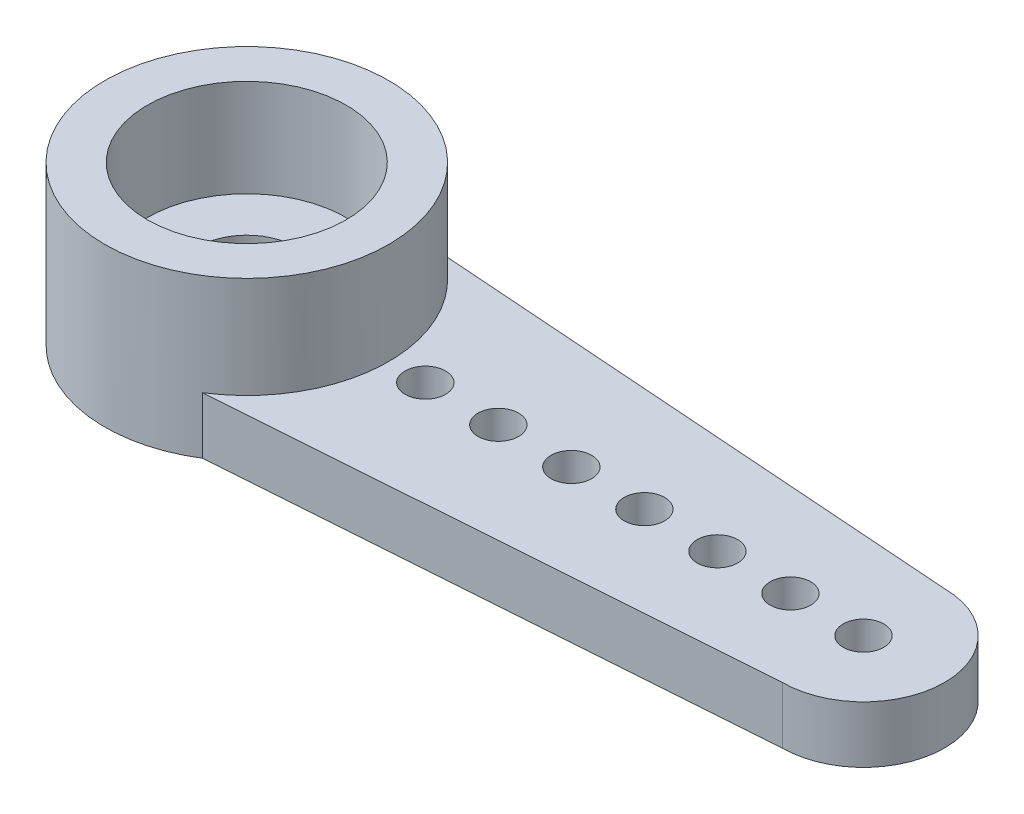
ISO-10303-21;
HEADER;
FILE_DESCRIPTION(('STEP AP214'),'2;1');
FILE_NAME('part.step','',(''),(''),'','','');
FILE_SCHEMA(('AUTOMOTIVE_DESIGN { 1 0 10303 214 1 1 1 1 }'));
ENDSEC;
DATA;
#1=APPLICATION_CONTEXT('core data for automotive mechanical design processes');
#2=APPLICATION_PROTOCOL_DEFINITION('international standard','automotive_design',2000,#1);
#3=PRODUCT_CONTEXT('',#1,'mechanical');
#4=PRODUCT('Part','Part','',(#3));
#5=PRODUCT_RELATED_PRODUCT_CATEGORY('part','',(#4));
#6=PRODUCT_DEFINITION_FORMATION('','',#4);
#7=PRODUCT_DEFINITION_CONTEXT('part definition',#1,'design');
#8=PRODUCT_DEFINITION('design','',#6,#7);
#9=PRODUCT_DEFINITION_SHAPE('','',#8);
#10=(LENGTH_UNIT() NAMED_UNIT(*) SI_UNIT(.MILLI.,.METRE.));
#11=(NAMED_UNIT(*) PLANE_ANGLE_UNIT() SI_UNIT($,.RADIAN.));
#12=(NAMED_UNIT(*) SI_UNIT($,.STERADIAN.) SOLID_ANGLE_UNIT());
#13=UNCERTAINTY_MEASURE_WITH_UNIT(LENGTH_MEASURE(1.E-05),#10,'distance_accuracy_value','');
#14=(GEOMETRIC_REPRESENTATION_CONTEXT(3) GLOBAL_UNCERTAINTY_ASSIGNED_CONTEXT((#13)) GLOBAL_UNIT_ASSIGNED_CONTEXT((#10,
#11,#12)) REPRESENTATION_CONTEXT('',''));
#15=CARTESIAN_POINT('',(0.,0.,0.));
#16=DIRECTION('',(0.,0.,1.));
#17=DIRECTION('',(1.,0.,0.));
#18=AXIS2_PLACEMENT_3D('',#15,#16,#17);
#19=CARTESIAN_POINT('',(-20.1688064969277,1.42837263825871,0.));
#20=DIRECTION('',(0.,1.,0.));
#21=DIRECTION('',(0.,0.,1.));
#22=AXIS2_PLACEMENT_3D('',#19,#20,#21);
#23=PLANE('',#22);
#24=CARTESIAN_POINT('',(6.58119350307226,1.42837263825871,0.));
#25=DIRECTION('',(0.,1.,0.));
#26=DIRECTION('',(0.,0.,1.));
#27=AXIS2_PLACEMENT_3D('',#24,#25,#26);
#28=CIRCLE('',#27,0.624999999999997);
#29=CARTESIAN_POINT('',(6.58119350307226,1.42837263825871,0.625000000000067));
#30=VERTEX_POINT('',#29);
#31=EDGE_CURVE('E133',#30,#30,#28,.T.);
#32=ORIENTED_EDGE('',*,*,#31,.F.);
#33=EDGE_LOOP('',(#32));
#34=FACE_BOUND('',#33,.T.);
#35=CARTESIAN_POINT('',(11.0811935030723,1.42837263825871,0.));
#36=DIRECTION('',(0.,1.,0.));
#37=DIRECTION('',(0.,0.,1.));
#38=AXIS2_PLACEMENT_3D('',#35,#36,#37);
#39=CIRCLE('',#38,0.624999999999997);
#40=CARTESIAN_POINT('',(11.0811935030723,1.42837263825871,0.625000000000036));
#41=VERTEX_POINT('',#40);
#42=EDGE_CURVE('E145',#41,#41,#39,.T.);
#43=ORIENTED_EDGE('',*,*,#42,.F.);
#44=EDGE_LOOP('',(#43));
#45=FACE_BOUND('',#44,.T.);
#46=CARTESIAN_POINT('',(15.5811935030723,1.42837263825871,0.));
#47=DIRECTION('',(0.,1.,0.));
#48=DIRECTION('',(0.,0.,1.));
#49=AXIS2_PLACEMENT_3D('',#46,#47,#48);
#50=CIRCLE('',#49,0.624999999999997);
#51=CARTESIAN_POINT('',(15.5811935030723,1.42837263825871,0.625000000000004));
#52=VERTEX_POINT('',#51);
#53=EDGE_CURVE('E157',#52,#52,#50,.T.);
#54=ORIENTED_EDGE('',*,*,#53,.F.);
#55=EDGE_LOOP('',(#54));
#56=FACE_BOUND('',#55,.T.);
#57=CARTESIAN_POINT('',(17.8311935030723,1.42837263825871,0.));
#58=DIRECTION('',(0.,1.,0.));
#59=DIRECTION('',(0.,0.,1.));
#60=AXIS2_PLACEMENT_3D('',#57,#58,#59);
#61=CIRCLE('',#60,0.624999999999997);
#62=CARTESIAN_POINT('',(17.8311935030723,1.42837263825871,0.624999999999988));
#63=VERTEX_POINT('',#62);
#64=EDGE_CURVE('E163',#63,#63,#61,.T.);
#65=ORIENTED_EDGE('',*,*,#64,.F.);
#66=EDGE_LOOP('',(#65));
#67=FACE_BOUND('',#66,.T.);
#68=CARTESIAN_POINT('',(13.3311935030723,1.42837263825871,0.));
#69=DIRECTION('',(0.,1.,0.));
#70=DIRECTION('',(0.,0.,1.));
#71=AXIS2_PLACEMENT_3D('',#68,#69,#70);
#72=CIRCLE('',#71,0.624999999999999);
#73=CARTESIAN_POINT('',(13.3311935030723,1.42837263825871,0.625000000000022));
#74=VERTEX_POINT('',#73);
#75=EDGE_CURVE('E151',#74,#74,#72,.T.);
#76=ORIENTED_EDGE('',*,*,#75,.F.);
#77=EDGE_LOOP('',(#76));
#78=FACE_BOUND('',#77,.T.);
#79=CARTESIAN_POINT('',(8.83119350307226,1.42837263825871,0.));
#80=DIRECTION('',(0.,1.,0.));
#81=DIRECTION('',(0.,0.,1.));
#82=AXIS2_PLACEMENT_3D('',#79,#80,#81);
#83=CIRCLE('',#82,0.624999999999997);
#84=CARTESIAN_POINT('',(8.83119350307226,1.42837263825871,0.625000000000051));
#85=VERTEX_POINT('',#84);
#86=EDGE_CURVE('E139',#85,#85,#83,.T.);
#87=ORIENTED_EDGE('',*,*,#86,.F.);
#88=EDGE_LOOP('',(#87));
#89=FACE_BOUND('',#88,.T.);
#90=CARTESIAN_POINT('',(4.33119350307226,1.42837263825871,0.));
#91=DIRECTION('',(0.,1.,0.));
#92=DIRECTION('',(0.,0.,1.));
#93=AXIS2_PLACEMENT_3D('',#90,#91,#92);
#94=CIRCLE('',#93,0.624999999999997);
#95=CARTESIAN_POINT('',(4.33119350307226,1.42837263825871,0.625000000000083));
#96=VERTEX_POINT('',#95);
#97=EDGE_CURVE('E127',#96,#96,#94,.T.);
#98=ORIENTED_EDGE('',*,*,#97,.F.);
#99=EDGE_LOOP('',(#98));
#100=FACE_BOUND('',#99,.T.);
#101=CARTESIAN_POINT('',(-1.16880649692774,1.42837263825871,0.));
#102=DIRECTION('',(0.,1.,0.));
#103=DIRECTION('',(0.,0.,1.));
#104=AXIS2_PLACEMENT_3D('',#101,#102,#103);
#105=CIRCLE('',#104,4.375);
#106=CARTESIAN_POINT('',(1.16692439419594,1.42837263825871,3.69932239798731));
#107=VERTEX_POINT('',#106);
#108=CARTESIAN_POINT('',(1.16692439419594,1.42837263825871,-3.69932239798731));
#109=VERTEX_POINT('',#108);
#110=EDGE_CURVE('E93',#107,#109,#105,.T.);
#111=ORIENTED_EDGE('',*,*,#110,.F.);
#112=DIRECTION('',(0.997420198870011,0.,-0.0717840294641297));
#113=VECTOR('',#112,1.);
#114=CARTESIAN_POINT('',(-19.7939974128962,1.42837263825871,5.20787358864924));
#115=LINE('',#114,#113);
#116=CARTESIAN_POINT('',(17.8311935030723,1.42837263825871,2.5));
#117=VERTEX_POINT('',#116);
#118=EDGE_CURVE('E107',#107,#117,#115,.T.);
#119=ORIENTED_EDGE('',*,*,#118,.T.);
#120=CARTESIAN_POINT('',(17.8311935030723,1.42837263825871,0.));
#121=DIRECTION('',(0.,1.,0.));
#122=DIRECTION('',(0.,0.,-1.));
#123=AXIS2_PLACEMENT_3D('',#120,#121,#122);
#124=CIRCLE('',#123,2.5);
#125=CARTESIAN_POINT('',(17.8311935030723,1.42837263825871,-2.5));
#126=VERTEX_POINT('',#125);
#127=EDGE_CURVE('E169',#117,#126,#124,.T.);
#128=ORIENTED_EDGE('',*,*,#127,.T.);
#129=DIRECTION('',(-0.997420198870011,0.,-0.0717840294641295));
#130=VECTOR('',#129,1.);
#131=CARTESIAN_POINT('',(-19.7939974128962,1.42837263825871,-5.20787358864924));
#132=LINE('',#131,#130);
#133=EDGE_CURVE('E104',#126,#109,#132,.T.);
#134=ORIENTED_EDGE('',*,*,#133,.T.);
#135=EDGE_LOOP('',(#111,#119,#128,#134));
#136=FACE_BOUND('',#135,.T.);
#137=ADVANCED_FACE('F40',(#34,#45,#56,#67,#78,#89,#100,#136),#23,.T.);
#138=CARTESIAN_POINT('',(-20.1688064969277,-0.321627361741287,0.));
#139=DIRECTION('',(0.,1.,0.));
#140=DIRECTION('',(0.,0.,1.));
#141=AXIS2_PLACEMENT_3D('',#138,#139,#140);
#142=PLANE('',#141);
#143=CARTESIAN_POINT('',(-1.16880649692774,-0.321627361741287,0.));
#144=DIRECTION('',(0.,-1.,0.));
#145=DIRECTION('',(0.,0.,-1.));
#146=AXIS2_PLACEMENT_3D('',#143,#144,#145);
#147=CIRCLE('',#146,2.9375);
#148=CARTESIAN_POINT('',(-1.16880649692774,-0.321627361741287,-2.9375));
#149=VERTEX_POINT('',#148);
#150=EDGE_CURVE('E119',#149,#149,#147,.T.);
#151=ORIENTED_EDGE('',*,*,#150,.F.);
#152=EDGE_LOOP('',(#151));
#153=FACE_BOUND('',#152,.T.);
#154=CARTESIAN_POINT('',(17.8311935030723,-0.321627361741287,0.));
#155=DIRECTION('',(0.,1.,0.));
#156=DIRECTION('',(0.,0.,1.));
#157=AXIS2_PLACEMENT_3D('',#154,#155,#156);
#158=CIRCLE('',#157,0.624999999999997);
#159=CARTESIAN_POINT('',(17.8311935030723,-0.321627361741287,0.624999999999988));
#160=VERTEX_POINT('',#159);
#161=EDGE_CURVE('E160',#160,#160,#158,.T.);
#162=ORIENTED_EDGE('',*,*,#161,.T.);
#163=EDGE_LOOP('',(#162));
#164=FACE_BOUND('',#163,.T.);
#165=CARTESIAN_POINT('',(15.5811935030723,-0.321627361741287,0.));
#166=DIRECTION('',(0.,1.,0.));
#167=DIRECTION('',(0.,0.,1.));
#168=AXIS2_PLACEMENT_3D('',#165,#166,#167);
#169=CIRCLE('',#168,0.624999999999997);
#170=CARTESIAN_POINT('',(15.5811935030723,-0.321627361741287,0.625000000000004));
#171=VERTEX_POINT('',#170);
#172=EDGE_CURVE('E154',#171,#171,#169,.T.);
#173=ORIENTED_EDGE('',*,*,#172,.T.);
#174=EDGE_LOOP('',(#173));
#175=FACE_BOUND('',#174,.T.);
#176=CARTESIAN_POINT('',(13.3311935030723,-0.321627361741287,0.));
#177=DIRECTION('',(0.,1.,0.));
#178=DIRECTION('',(0.,0.,1.));
#179=AXIS2_PLACEMENT_3D('',#176,#177,#178);
#180=CIRCLE('',#179,0.624999999999999);
#181=CARTESIAN_POINT('',(13.3311935030723,-0.321627361741287,0.625000000000022));
#182=VERTEX_POINT('',#181);
#183=EDGE_CURVE('E148',#182,#182,#180,.T.);
#184=ORIENTED_EDGE('',*,*,#183,.T.);
#185=EDGE_LOOP('',(#184));
#186=FACE_BOUND('',#185,.T.);
#187=CARTESIAN_POINT('',(11.0811935030723,-0.321627361741287,0.));
#188=DIRECTION('',(0.,1.,0.));
#189=DIRECTION('',(0.,0.,1.));
#190=AXIS2_PLACEMENT_3D('',#187,#188,#189);
#191=CIRCLE('',#190,0.624999999999997);
#192=CARTESIAN_POINT('',(11.0811935030723,-0.321627361741287,0.625000000000036));
#193=VERTEX_POINT('',#192);
#194=EDGE_CURVE('E142',#193,#193,#191,.T.);
#195=ORIENTED_EDGE('',*,*,#194,.T.);
#196=EDGE_LOOP('',(#195));
#197=FACE_BOUND('',#196,.T.);
#198=CARTESIAN_POINT('',(8.83119350307226,-0.321627361741287,0.));
#199=DIRECTION('',(0.,1.,0.));
#200=DIRECTION('',(0.,0.,1.));
#201=AXIS2_PLACEMENT_3D('',#198,#199,#200);
#202=CIRCLE('',#201,0.624999999999997);
#203=CARTESIAN_POINT('',(8.83119350307226,-0.321627361741287,0.625000000000051));
#204=VERTEX_POINT('',#203);
#205=EDGE_CURVE('E136',#204,#204,#202,.T.);
#206=ORIENTED_EDGE('',*,*,#205,.T.);
#207=EDGE_LOOP('',(#206));
#208=FACE_BOUND('',#207,.T.);
#209=CARTESIAN_POINT('',(6.58119350307226,-0.321627361741287,0.));
#210=DIRECTION('',(0.,1.,0.));
#211=DIRECTION('',(0.,0.,1.));
#212=AXIS2_PLACEMENT_3D('',#209,#210,#211);
#213=CIRCLE('',#212,0.624999999999997);
#214=CARTESIAN_POINT('',(6.58119350307226,-0.321627361741287,0.625000000000067));
#215=VERTEX_POINT('',#214);
#216=EDGE_CURVE('E130',#215,#215,#213,.T.);
#217=ORIENTED_EDGE('',*,*,#216,.T.);
#218=EDGE_LOOP('',(#217));
#219=FACE_BOUND('',#218,.T.);
#220=CARTESIAN_POINT('',(4.33119350307226,-0.321627361741287,0.));
#221=DIRECTION('',(0.,1.,0.));
#222=DIRECTION('',(0.,0.,1.));
#223=AXIS2_PLACEMENT_3D('',#220,#221,#222);
#224=CIRCLE('',#223,0.624999999999997);
#225=CARTESIAN_POINT('',(4.33119350307226,-0.321627361741287,0.625000000000083));
#226=VERTEX_POINT('',#225);
#227=EDGE_CURVE('E124',#226,#226,#224,.T.);
#228=ORIENTED_EDGE('',*,*,#227,.T.);
#229=EDGE_LOOP('',(#228));
#230=FACE_BOUND('',#229,.T.);
#231=CARTESIAN_POINT('',(-1.16880649692774,-0.321627361741287,0.));
#232=DIRECTION('',(0.,-1.,0.));
#233=DIRECTION('',(0.,0.,-1.));
#234=AXIS2_PLACEMENT_3D('',#231,#232,#233);
#235=CIRCLE('',#234,4.375);
#236=CARTESIAN_POINT('',(1.16692439419594,-0.321627361741287,3.69932239798731));
#237=VERTEX_POINT('',#236);
#238=CARTESIAN_POINT('',(1.16692439419594,-0.321627361741287,-3.69932239798731));
#239=VERTEX_POINT('',#238);
#240=EDGE_CURVE('E78',#237,#239,#235,.T.);
#241=ORIENTED_EDGE('',*,*,#240,.T.);
#242=DIRECTION('',(0.997420198870011,0.,0.0717840294641295));
#243=VECTOR('',#242,1.);
#244=CARTESIAN_POINT('',(1.16692439419594,-0.321627361741287,-3.69932239798731));
#245=LINE('',#244,#243);
#246=CARTESIAN_POINT('',(17.8311935030723,-0.321627361741287,-2.5));
#247=VERTEX_POINT('',#246);
#248=EDGE_CURVE('E83',#239,#247,#245,.T.);
#249=ORIENTED_EDGE('',*,*,#248,.T.);
#250=CARTESIAN_POINT('',(17.8311935030723,-0.321627361741287,0.));
#251=DIRECTION('',(0.,1.,0.));
#252=DIRECTION('',(0.,0.,-1.));
#253=AXIS2_PLACEMENT_3D('',#250,#251,#252);
#254=CIRCLE('',#253,2.5);
#255=CARTESIAN_POINT('',(17.8311935030722,-0.321627361741287,2.49999999999999));
#256=VERTEX_POINT('',#255);
#257=EDGE_CURVE('E166',#256,#247,#254,.T.);
#258=ORIENTED_EDGE('',*,*,#257,.F.);
#259=DIRECTION('',(-0.997420198870011,0.,0.0717840294641296));
#260=VECTOR('',#259,1.);
#261=CARTESIAN_POINT('',(17.8311935030723,-0.321627361741287,2.5));
#262=LINE('',#261,#260);
#263=EDGE_CURVE('E55',#256,#237,#262,.T.);
#264=ORIENTED_EDGE('',*,*,#263,.T.);
#265=EDGE_LOOP('',(#241,#249,#258,#264));
#266=FACE_BOUND('',#265,.T.);
#267=ADVANCED_FACE('F80',(#153,#164,#175,#186,#197,#208,#219,#230,#266),#142,.F.);
#268=CARTESIAN_POINT('',(17.8311935030723,1.42837263825871,0.));
#269=DIRECTION('',(0.,-1.,0.));
#270=DIRECTION('',(0.,0.,-1.));
#271=AXIS2_PLACEMENT_3D('',#268,#269,#270);
#272=CYLINDRICAL_SURFACE('',#271,2.5);
#273=ORIENTED_EDGE('',*,*,#257,.T.);
#274=DIRECTION('',(0.,-1.,0.));
#275=VECTOR('',#274,1.);
#276=CARTESIAN_POINT('',(17.8311935030723,1.42837263825871,-2.50000000000001));
#277=LINE('',#276,#275);
#278=EDGE_CURVE('E100',#126,#247,#277,.T.);
#279=ORIENTED_EDGE('',*,*,#278,.F.);
#280=ORIENTED_EDGE('',*,*,#127,.F.);
#281=DIRECTION('',(0.,-1.,0.));
#282=VECTOR('',#281,1.);
#283=CARTESIAN_POINT('',(17.8311935030722,1.42837263825871,2.49999999999999));
#284=LINE('',#283,#282);
#285=EDGE_CURVE('E48',#117,#256,#284,.T.);
#286=ORIENTED_EDGE('',*,*,#285,.T.);
#287=EDGE_LOOP('',(#273,#279,#280,#286));
#288=FACE_BOUND('',#287,.T.);
#289=ADVANCED_FACE('F42',(#288),#272,.T.);
#290=CARTESIAN_POINT('',(17.8311935030723,1.42837263825871,0.));
#291=DIRECTION('',(0.,-1.,0.));
#292=DIRECTION('',(0.,0.,-1.));
#293=AXIS2_PLACEMENT_3D('',#290,#291,#292);
#294=CYLINDRICAL_SURFACE('',#293,0.624999999999997);
#295=ORIENTED_EDGE('',*,*,#64,.T.);
#296=EDGE_LOOP('',(#295));
#297=FACE_BOUND('',#296,.T.);
#298=ORIENTED_EDGE('',*,*,#161,.F.);
#299=EDGE_LOOP('',(#298));
#300=FACE_BOUND('',#299,.T.);
#301=ADVANCED_FACE('F228',(#297,#300),#294,.F.);
#302=CARTESIAN_POINT('',(15.5811935030723,1.42837263825871,0.));
#303=DIRECTION('',(0.,-1.,0.));
#304=DIRECTION('',(0.,0.,-1.));
#305=AXIS2_PLACEMENT_3D('',#302,#303,#304);
#306=CYLINDRICAL_SURFACE('',#305,0.624999999999997);
#307=ORIENTED_EDGE('',*,*,#53,.T.);
#308=EDGE_LOOP('',(#307));
#309=FACE_BOUND('',#308,.T.);
#310=ORIENTED_EDGE('',*,*,#172,.F.);
#311=EDGE_LOOP('',(#310));
#312=FACE_BOUND('',#311,.T.);
#313=ADVANCED_FACE('F231',(#309,#312),#306,.F.);
#314=CARTESIAN_POINT('',(13.3311935030723,1.42837263825871,0.));
#315=DIRECTION('',(0.,-1.,0.));
#316=DIRECTION('',(0.,0.,-1.));
#317=AXIS2_PLACEMENT_3D('',#314,#315,#316);
#318=CYLINDRICAL_SURFACE('',#317,0.624999999999999);
#319=ORIENTED_EDGE('',*,*,#75,.T.);
#320=EDGE_LOOP('',(#319));
#321=FACE_BOUND('',#320,.T.);
#322=ORIENTED_EDGE('',*,*,#183,.F.);
#323=EDGE_LOOP('',(#322));
#324=FACE_BOUND('',#323,.T.);
#325=ADVANCED_FACE('F235',(#321,#324),#318,.F.);
#326=CARTESIAN_POINT('',(11.0811935030723,1.42837263825871,0.));
#327=DIRECTION('',(0.,-1.,0.));
#328=DIRECTION('',(0.,0.,-1.));
#329=AXIS2_PLACEMENT_3D('',#326,#327,#328);
#330=CYLINDRICAL_SURFACE('',#329,0.624999999999997);
#331=ORIENTED_EDGE('',*,*,#42,.T.);
#332=EDGE_LOOP('',(#331));
#333=FACE_BOUND('',#332,.T.);
#334=ORIENTED_EDGE('',*,*,#194,.F.);
#335=EDGE_LOOP('',(#334));
#336=FACE_BOUND('',#335,.T.);
#337=ADVANCED_FACE('F239',(#333,#336),#330,.F.);
#338=CARTESIAN_POINT('',(8.83119350307226,1.42837263825871,0.));
#339=DIRECTION('',(0.,-1.,0.));
#340=DIRECTION('',(0.,0.,-1.));
#341=AXIS2_PLACEMENT_3D('',#338,#339,#340);
#342=CYLINDRICAL_SURFACE('',#341,0.624999999999997);
#343=ORIENTED_EDGE('',*,*,#86,.T.);
#344=EDGE_LOOP('',(#343));
#345=FACE_BOUND('',#344,.T.);
#346=ORIENTED_EDGE('',*,*,#205,.F.);
#347=EDGE_LOOP('',(#346));
#348=FACE_BOUND('',#347,.T.);
#349=ADVANCED_FACE('F217',(#345,#348),#342,.F.);
#350=CARTESIAN_POINT('',(6.58119350307226,1.42837263825871,0.));
#351=DIRECTION('',(0.,-1.,0.));
#352=DIRECTION('',(0.,0.,-1.));
#353=AXIS2_PLACEMENT_3D('',#350,#351,#352);
#354=CYLINDRICAL_SURFACE('',#353,0.624999999999997);
#355=ORIENTED_EDGE('',*,*,#31,.T.);
#356=EDGE_LOOP('',(#355));
#357=FACE_BOUND('',#356,.T.);
#358=ORIENTED_EDGE('',*,*,#216,.F.);
#359=EDGE_LOOP('',(#358));
#360=FACE_BOUND('',#359,.T.);
#361=ADVANCED_FACE('F211',(#357,#360),#354,.F.);
#362=CARTESIAN_POINT('',(4.33119350307226,1.42837263825871,0.));
#363=DIRECTION('',(0.,-1.,0.));
#364=DIRECTION('',(0.,0.,-1.));
#365=AXIS2_PLACEMENT_3D('',#362,#363,#364);
#366=CYLINDRICAL_SURFACE('',#365,0.624999999999997);
#367=ORIENTED_EDGE('',*,*,#97,.T.);
#368=EDGE_LOOP('',(#367));
#369=FACE_BOUND('',#368,.T.);
#370=ORIENTED_EDGE('',*,*,#227,.F.);
#371=EDGE_LOOP('',(#370));
#372=FACE_BOUND('',#371,.T.);
#373=ADVANCED_FACE('F190',(#369,#372),#366,.F.);
#374=CARTESIAN_POINT('',(-1.16880649692774,0.928372638258713,0.));
#375=DIRECTION('',(0.,-1.,0.));
#376=DIRECTION('',(0.,0.,-1.));
#377=AXIS2_PLACEMENT_3D('',#374,#375,#376);
#378=CYLINDRICAL_SURFACE('',#377,2.9375);
#379=CARTESIAN_POINT('',(-1.16880649692774,0.928372638258713,0.));
#380=DIRECTION('',(0.,-1.,0.));
#381=DIRECTION('',(0.,0.,-1.));
#382=AXIS2_PLACEMENT_3D('',#379,#380,#381);
#383=CIRCLE('',#382,2.9375);
#384=CARTESIAN_POINT('',(-1.16880649692774,0.928372638258713,-2.9375));
#385=VERTEX_POINT('',#384);
#386=EDGE_CURVE('E121',#385,#385,#383,.T.);
#387=ORIENTED_EDGE('',*,*,#386,.F.);
#388=EDGE_LOOP('',(#387));
#389=FACE_BOUND('',#388,.T.);
#390=ORIENTED_EDGE('',*,*,#150,.T.);
#391=EDGE_LOOP('',(#390));
#392=FACE_BOUND('',#391,.T.);
#393=ADVANCED_FACE('F184',(#389,#392),#378,.F.);
#394=CARTESIAN_POINT('',(-1.16880649692774,0.928372638258713,0.));
#395=DIRECTION('',(0.,-1.,0.));
#396=DIRECTION('',(0.,0.,-1.));
#397=AXIS2_PLACEMENT_3D('',#394,#395,#396);
#398=PLANE('',#397);
#399=CARTESIAN_POINT('',(-1.16880649692774,0.928372638258713,0.));
#400=DIRECTION('',(0.,-1.,0.));
#401=DIRECTION('',(0.,0.,-1.));
#402=AXIS2_PLACEMENT_3D('',#399,#400,#401);
#403=CIRCLE('',#402,1.5);
#404=CARTESIAN_POINT('',(-1.16880649692774,0.928372638258713,-1.5));
#405=VERTEX_POINT('',#404);
#406=EDGE_CURVE('E112',#405,#405,#403,.T.);
#407=ORIENTED_EDGE('',*,*,#406,.F.);
#408=EDGE_LOOP('',(#407));
#409=FACE_BOUND('',#408,.T.);
#410=ORIENTED_EDGE('',*,*,#386,.T.);
#411=EDGE_LOOP('',(#410));
#412=FACE_BOUND('',#411,.T.);
#413=ADVANCED_FACE('F180',(#409,#412),#398,.T.);
#414=CARTESIAN_POINT('',(-1.16880649692774,4.55337263825871,0.));
#415=DIRECTION('',(0.,1.,0.));
#416=DIRECTION('',(0.,0.,1.));
#417=AXIS2_PLACEMENT_3D('',#414,#415,#416);
#418=PLANE('',#417);
#419=CARTESIAN_POINT('',(-1.16880649692774,4.55337263825871,0.));
#420=DIRECTION('',(0.,1.,0.));
#421=DIRECTION('',(0.,0.,1.));
#422=AXIS2_PLACEMENT_3D('',#419,#420,#421);
#423=CIRCLE('',#422,4.375);
#424=CARTESIAN_POINT('',(-1.16880649692774,4.55337263825871,4.375));
#425=VERTEX_POINT('',#424);
#426=EDGE_CURVE('E116',#425,#425,#423,.T.);
#427=ORIENTED_EDGE('',*,*,#426,.T.);
#428=EDGE_LOOP('',(#427));
#429=FACE_BOUND('',#428,.T.);
#430=CARTESIAN_POINT('',(-1.16880649692774,4.55337263825871,0.));
#431=DIRECTION('',(0.,1.,0.));
#432=DIRECTION('',(0.,0.,1.));
#433=AXIS2_PLACEMENT_3D('',#430,#431,#432);
#434=CIRCLE('',#433,3.0625);
#435=CARTESIAN_POINT('',(-1.16880649692774,4.55337263825871,3.0625));
#436=VERTEX_POINT('',#435);
#437=EDGE_CURVE('E113',#436,#436,#434,.T.);
#438=ORIENTED_EDGE('',*,*,#437,.F.);
#439=EDGE_LOOP('',(#438));
#440=FACE_BOUND('',#439,.T.);
#441=ADVANCED_FACE('F183',(#429,#440),#418,.T.);
#442=CARTESIAN_POINT('',(-1.16880649692774,4.55337263825871,0.));
#443=DIRECTION('',(0.,-1.,0.));
#444=DIRECTION('',(0.,0.,-1.));
#445=AXIS2_PLACEMENT_3D('',#442,#443,#444);
#446=CYLINDRICAL_SURFACE('',#445,4.375);
#447=DIRECTION('',(0.,-1.,0.));
#448=VECTOR('',#447,1.);
#449=CARTESIAN_POINT('',(1.16692439419594,4.55337263825871,-3.69932239798731));
#450=LINE('',#449,#448);
#451=EDGE_CURVE('E87',#109,#239,#450,.T.);
#452=ORIENTED_EDGE('',*,*,#451,.T.);
#453=ORIENTED_EDGE('',*,*,#240,.F.);
#454=DIRECTION('',(0.,-1.,0.));
#455=VECTOR('',#454,1.);
#456=CARTESIAN_POINT('',(1.16692439419594,4.55337263825871,3.69932239798731));
#457=LINE('',#456,#455);
#458=EDGE_CURVE('E96',#107,#237,#457,.T.);
#459=ORIENTED_EDGE('',*,*,#458,.F.);
#460=ORIENTED_EDGE('',*,*,#110,.T.);
#461=EDGE_LOOP('',(#452,#453,#459,#460));
#462=FACE_BOUND('',#461,.T.);
#463=ORIENTED_EDGE('',*,*,#426,.F.);
#464=EDGE_LOOP('',(#463));
#465=FACE_BOUND('',#464,.T.);
#466=ADVANCED_FACE('F90',(#462,#465),#446,.T.);
#467=CARTESIAN_POINT('',(-1.16880649692774,4.55337263825871,0.));
#468=DIRECTION('',(0.,-1.,0.));
#469=DIRECTION('',(0.,0.,-1.));
#470=AXIS2_PLACEMENT_3D('',#467,#468,#469);
#471=CYLINDRICAL_SURFACE('',#470,3.0625);
#472=CARTESIAN_POINT('',(-1.16880649692774,1.55337263825871,0.));
#473=DIRECTION('',(0.,1.,0.));
#474=DIRECTION('',(0.,0.,1.));
#475=AXIS2_PLACEMENT_3D('',#472,#473,#474);
#476=CIRCLE('',#475,3.0625);
#477=CARTESIAN_POINT('',(-1.16880649692774,1.55337263825871,3.0625));
#478=VERTEX_POINT('',#477);
#479=EDGE_CURVE('E11',#478,#478,#476,.T.);
#480=ORIENTED_EDGE('',*,*,#479,.F.);
#481=EDGE_LOOP('',(#480));
#482=FACE_BOUND('',#481,.T.);
#483=ORIENTED_EDGE('',*,*,#437,.T.);
#484=EDGE_LOOP('',(#483));
#485=FACE_BOUND('',#484,.T.);
#486=ADVANCED_FACE('F324',(#482,#485),#471,.F.);
#487=CARTESIAN_POINT('',(-1.16880649692774,-0.321627361741287,0.));
#488=DIRECTION('',(0.,1.,0.));
#489=DIRECTION('',(0.,0.,1.));
#490=AXIS2_PLACEMENT_3D('',#487,#488,#489);
#491=CYLINDRICAL_SURFACE('',#490,1.5);
#492=ORIENTED_EDGE('',*,*,#406,.T.);
#493=EDGE_LOOP('',(#492));
#494=FACE_BOUND('',#493,.T.);
#495=CARTESIAN_POINT('',(-1.16880649692774,1.55337263825871,0.));
#496=DIRECTION('',(0.,1.,0.));
#497=DIRECTION('',(0.,0.,1.));
#498=AXIS2_PLACEMENT_3D('',#495,#496,#497);
#499=CIRCLE('',#498,1.5);
#500=CARTESIAN_POINT('',(-1.16880649692774,1.55337263825871,1.5));
#501=VERTEX_POINT('',#500);
#502=EDGE_CURVE('E109',#501,#501,#499,.T.);
#503=ORIENTED_EDGE('',*,*,#502,.T.);
#504=EDGE_LOOP('',(#503));
#505=FACE_BOUND('',#504,.T.);
#506=ADVANCED_FACE('F177',(#494,#505),#491,.F.);
#507=CARTESIAN_POINT('',(-1.16880649692774,1.55337263825871,0.));
#508=DIRECTION('',(0.,1.,0.));
#509=DIRECTION('',(0.,0.,1.));
#510=AXIS2_PLACEMENT_3D('',#507,#508,#509);
#511=PLANE('',#510);
#512=ORIENTED_EDGE('',*,*,#479,.T.);
#513=EDGE_LOOP('',(#512));
#514=FACE_BOUND('',#513,.T.);
#515=ORIENTED_EDGE('',*,*,#502,.F.);
#516=EDGE_LOOP('',(#515));
#517=FACE_BOUND('',#516,.T.);
#518=ADVANCED_FACE('F344',(#514,#517),#511,.T.);
#519=CARTESIAN_POINT('',(1.16692439419594,4.55337263825871,-3.69932239798731));
#520=DIRECTION('',(0.0717840294641295,0.,-0.997420198870011));
#521=DIRECTION('',(-0.997420198870011,0.,-0.0717840294641295));
#522=AXIS2_PLACEMENT_3D('',#519,#520,#521);
#523=PLANE('',#522);
#524=ORIENTED_EDGE('',*,*,#278,.T.);
#525=ORIENTED_EDGE('',*,*,#248,.F.);
#526=ORIENTED_EDGE('',*,*,#451,.F.);
#527=ORIENTED_EDGE('',*,*,#133,.F.);
#528=EDGE_LOOP('',(#524,#525,#526,#527));
#529=FACE_BOUND('',#528,.T.);
#530=ADVANCED_FACE('F98',(#529),#523,.T.);
#531=CARTESIAN_POINT('',(17.8311935030723,4.55337263825871,2.5));
#532=DIRECTION('',(0.0717840294641297,0.,0.997420198870011));
#533=DIRECTION('',(0.997420198870011,0.,-0.0717840294641297));
#534=AXIS2_PLACEMENT_3D('',#531,#532,#533);
#535=PLANE('',#534);
#536=ORIENTED_EDGE('',*,*,#458,.T.);
#537=ORIENTED_EDGE('',*,*,#263,.F.);
#538=ORIENTED_EDGE('',*,*,#285,.F.);
#539=ORIENTED_EDGE('',*,*,#118,.F.);
#540=EDGE_LOOP('',(#536,#537,#538,#539));
#541=FACE_BOUND('',#540,.T.);
#542=ADVANCED_FACE('F362',(#541),#535,.T.);
#543=CLOSED_SHELL('',(#137,#267,#289,#301,#313,#325,#337,#349,#361,#373,#393,#413,#441,#466,
#486,#506,#518,#530,#542));
#544=MANIFOLD_SOLID_BREP('B2',#543);
#545=ADVANCED_BREP_SHAPE_REPRESENTATION('',(#18,#544),#14);
#546=SHAPE_DEFINITION_REPRESENTATION(#9,#545);
ENDSEC;
END-ISO-10303-21;
